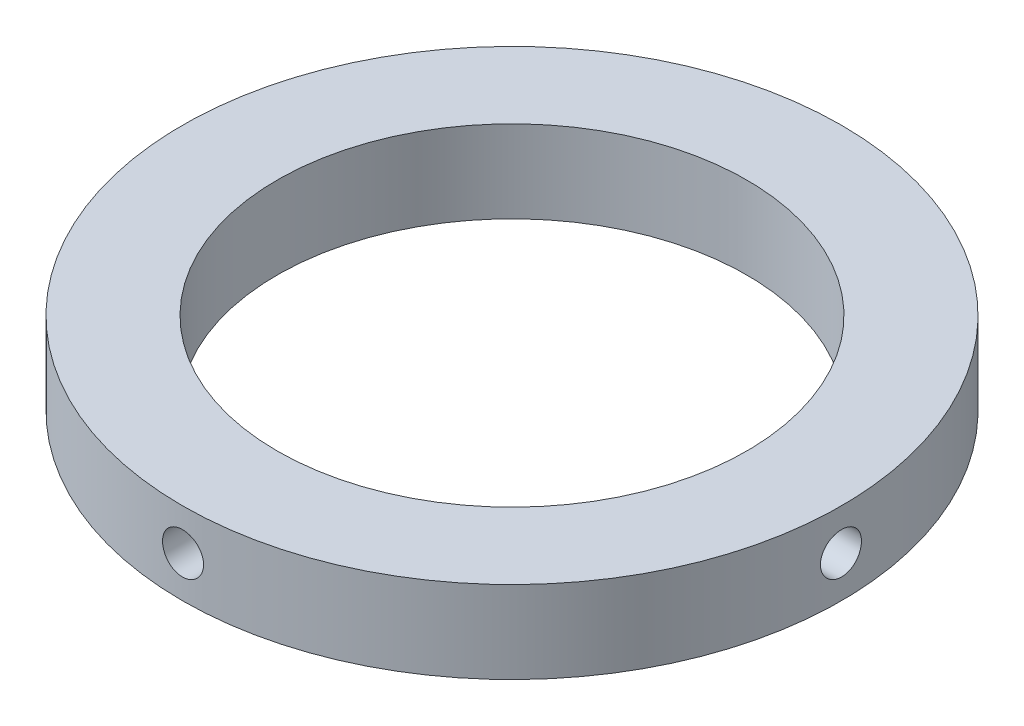
ISO-10303-21;
HEADER;
FILE_DESCRIPTION(('STEP AP214'),'2;1');
FILE_NAME('part.step','',(''),(''),'','','');
FILE_SCHEMA(('AUTOMOTIVE_DESIGN { 1 0 10303 214 1 1 1 1 }'));
ENDSEC;
DATA;
#1=APPLICATION_CONTEXT('core data for automotive mechanical design processes');
#2=APPLICATION_PROTOCOL_DEFINITION('international standard','automotive_design',2000,#1);
#3=PRODUCT_CONTEXT('',#1,'mechanical');
#4=PRODUCT('Part','Part','',(#3));
#5=PRODUCT_RELATED_PRODUCT_CATEGORY('part','',(#4));
#6=PRODUCT_DEFINITION_FORMATION('','',#4);
#7=PRODUCT_DEFINITION_CONTEXT('part definition',#1,'design');
#8=PRODUCT_DEFINITION('design','',#6,#7);
#9=PRODUCT_DEFINITION_SHAPE('','',#8);
#10=(LENGTH_UNIT() NAMED_UNIT(*) SI_UNIT(.MILLI.,.METRE.));
#11=(NAMED_UNIT(*) PLANE_ANGLE_UNIT() SI_UNIT($,.RADIAN.));
#12=(NAMED_UNIT(*) SI_UNIT($,.STERADIAN.) SOLID_ANGLE_UNIT());
#13=UNCERTAINTY_MEASURE_WITH_UNIT(LENGTH_MEASURE(1.E-05),#10,'distance_accuracy_value','');
#14=(GEOMETRIC_REPRESENTATION_CONTEXT(3) GLOBAL_UNCERTAINTY_ASSIGNED_CONTEXT((#13)) GLOBAL_UNIT_ASSIGNED_CONTEXT((#10,
#11,#12)) REPRESENTATION_CONTEXT('',''));
#15=CARTESIAN_POINT('',(0.,0.,0.));
#16=DIRECTION('',(0.,0.,1.));
#17=DIRECTION('',(1.,0.,0.));
#18=AXIS2_PLACEMENT_3D('',#15,#16,#17);
#19=CARTESIAN_POINT('',(0.,22.7096404931965,0.));
#20=DIRECTION('',(0.,1.,0.));
#21=DIRECTION('',(0.,0.,1.));
#22=AXIS2_PLACEMENT_3D('',#19,#20,#21);
#23=CYLINDRICAL_SURFACE('',#22,27.178);
#24=CARTESIAN_POINT('',(0.,-9.525,0.));
#25=DIRECTION('',(0.,1.,0.));
#26=DIRECTION('',(0.,0.,1.));
#27=AXIS2_PLACEMENT_3D('',#24,#25,#26);
#28=CIRCLE('',#27,27.178);
#29=CARTESIAN_POINT('',(0.,-9.525,27.178));
#30=VERTEX_POINT('',#29);
#31=EDGE_CURVE('E59',#30,#30,#28,.T.);
#32=ORIENTED_EDGE('',*,*,#31,.F.);
#33=EDGE_LOOP('',(#32));
#34=FACE_BOUND('',#33,.T.);
#35=CARTESIAN_POINT('',(0.,0.,0.));
#36=DIRECTION('',(0.,1.,0.));
#37=DIRECTION('',(0.,0.,1.));
#38=AXIS2_PLACEMENT_3D('',#35,#36,#37);
#39=CIRCLE('',#38,27.178);
#40=CARTESIAN_POINT('',(0.,0.,27.178));
#41=VERTEX_POINT('',#40);
#42=EDGE_CURVE('E46',#41,#41,#39,.T.);
#43=ORIENTED_EDGE('',*,*,#42,.T.);
#44=EDGE_LOOP('',(#43));
#45=FACE_BOUND('',#44,.T.);
#46=ADVANCED_FACE('F35',(#34,#45),#23,.F.);
#47=CARTESIAN_POINT('',(27.178,0.,0.));
#48=DIRECTION('',(0.,-1.,0.));
#49=DIRECTION('',(0.,0.,-1.));
#50=AXIS2_PLACEMENT_3D('',#47,#48,#49);
#51=PLANE('',#50);
#52=ORIENTED_EDGE('',*,*,#42,.F.);
#53=EDGE_LOOP('',(#52));
#54=FACE_BOUND('',#53,.T.);
#55=CARTESIAN_POINT('',(0.,0.,0.));
#56=DIRECTION('',(0.,1.,0.));
#57=DIRECTION('',(0.,0.,1.));
#58=AXIS2_PLACEMENT_3D('',#55,#56,#57);
#59=CIRCLE('',#58,38.1508);
#60=CARTESIAN_POINT('',(0.,0.,38.1508));
#61=VERTEX_POINT('',#60);
#62=EDGE_CURVE('E50',#61,#61,#59,.T.);
#63=ORIENTED_EDGE('',*,*,#62,.T.);
#64=EDGE_LOOP('',(#63));
#65=FACE_BOUND('',#64,.T.);
#66=ADVANCED_FACE('F124',(#54,#65),#51,.F.);
#67=CARTESIAN_POINT('',(0.,22.7096404931965,0.));
#68=DIRECTION('',(0.,1.,0.));
#69=DIRECTION('',(0.,0.,1.));
#70=AXIS2_PLACEMENT_3D('',#67,#68,#69);
#71=CYLINDRICAL_SURFACE('',#70,38.1508);
#72=CARTESIAN_POINT('',(2.37490000000013,-4.7625,38.0768090920182));
#73=CARTESIAN_POINT('',(2.37489413587054,-4.89576044221332,38.0768100819438));
#74=CARTESIAN_POINT('',(2.36364603924137,-5.02911422015652,38.0775161883294));
#75=CARTESIAN_POINT('',(2.31893657361418,-5.292139622471,38.0802646535465));
#76=CARTESIAN_POINT('',(2.28544934224318,-5.42180677629042,38.0823085681043));
#77=CARTESIAN_POINT('',(2.1972271338628,-5.67361089539293,38.0875002420932));
#78=CARTESIAN_POINT('',(2.14250336402685,-5.79575179318114,38.0906474192143));
#79=CARTESIAN_POINT('',(2.01337959405476,-6.02908230479438,38.0976902671423));
#80=CARTESIAN_POINT('',(1.93898410247809,-6.14027441996588,38.1015857663855));
#81=CARTESIAN_POINT('',(1.77250693564029,-6.348748916997,38.1096929054201));
#82=CARTESIAN_POINT('',(1.68040211679733,-6.4460128031849,38.1139049544608));
#83=CARTESIAN_POINT('',(1.48116851449557,-6.62371161253613,38.1221667814194));
#84=CARTESIAN_POINT('',(1.37403910499195,-6.7041458340926,38.1262165525665));
#85=CARTESIAN_POINT('',(1.14769361590035,-6.84595840493212,38.1337010098159));
#86=CARTESIAN_POINT('',(1.02846798471447,-6.90732153721154,38.1371352038233));
#87=CARTESIAN_POINT('',(0.781381432870346,-7.0091526031743,38.1429972531246));
#88=CARTESIAN_POINT('',(0.653520604057745,-7.04962075906114,38.1454251191201));
#89=CARTESIAN_POINT('',(0.39297057238683,-7.10846204704709,38.14899812944));
#90=CARTESIAN_POINT('',(0.260287906823709,-7.12686402310435,38.1501449481596));
#91=CARTESIAN_POINT('',(-0.00628768139390037,-7.14113965868731,38.1510322802792));
#92=CARTESIAN_POINT('',(-0.140180590481272,-7.13701357044605,38.1507728094246));
#93=CARTESIAN_POINT('',(-0.405180563899317,-7.10637400208002,38.1488781975727));
#94=CARTESIAN_POINT('',(-0.53629123137161,-7.07989155109398,38.1472449632788));
#95=CARTESIAN_POINT('',(-0.792202661450277,-7.00533914665999,38.1427888978946));
#96=CARTESIAN_POINT('',(-0.91700338698951,-6.957269066414,38.139966059817));
#97=CARTESIAN_POINT('',(-1.15685190217948,-6.84087079654324,38.1334453417321));
#98=CARTESIAN_POINT('',(-1.2718928497054,-6.77252854352541,38.1297468546226));
#99=CARTESIAN_POINT('',(-1.48888149211945,-6.61753614849848,38.1218910792771));
#100=CARTESIAN_POINT('',(-1.59082904086112,-6.5308858021659,38.1177337859211));
#101=CARTESIAN_POINT('',(-1.77891807210959,-6.34156165595712,38.1094199524433));
#102=CARTESIAN_POINT('',(-1.86503244858612,-6.23886092399679,38.1052634255623));
#103=CARTESIAN_POINT('',(-2.01880167507849,-6.02044566814982,38.0974267833623));
#104=CARTESIAN_POINT('',(-2.08645651781064,-5.90473113912826,38.0937466682312));
#105=CARTESIAN_POINT('',(-2.20138426186229,-5.66355579329118,38.0872784233891));
#106=CARTESIAN_POINT('',(-2.24865602416464,-5.53809443227981,38.0844903435277));
#107=CARTESIAN_POINT('',(-2.32145703284915,-5.28099470148214,38.0801223662642));
#108=CARTESIAN_POINT('',(-2.34698653295659,-5.14935640379765,38.078542454763));
#109=CARTESIAN_POINT('',(-2.37554456262062,-4.88387596537421,38.0767716250643));
#110=CARTESIAN_POINT('',(-2.37861076963935,-4.75003789247612,38.0765783810341));
#111=CARTESIAN_POINT('',(-2.36225361437003,-4.48374924305812,38.0775966028876));
#112=CARTESIAN_POINT('',(-2.3428303681567,-4.35129865938052,38.0788080615213));
#113=CARTESIAN_POINT('',(-2.28207695841365,-4.09165130885762,38.0824970401971));
#114=CARTESIAN_POINT('',(-2.24076414495911,-3.96445046691895,38.0849735574747));
#115=CARTESIAN_POINT('',(-2.13742189487203,-3.71878759389541,38.0909127162222));
#116=CARTESIAN_POINT('',(-2.07539227186086,-3.6003256414416,38.0943753665638));
#117=CARTESIAN_POINT('',(-1.9322809069873,-3.37533017563438,38.1019022210509));
#118=CARTESIAN_POINT('',(-1.85117391791038,-3.26881274807502,38.1059672196904));
#119=CARTESIAN_POINT('',(-1.67224690008276,-3.07089200982624,38.1142378988531));
#120=CARTESIAN_POINT('',(-1.57442670893701,-2.97948884601266,38.1184435807429));
#121=CARTESIAN_POINT('',(-1.36468789444931,-2.81426398702312,38.1265285018216));
#122=CARTESIAN_POINT('',(-1.25275004490291,-2.740466672447,38.1304072835698));
#123=CARTESIAN_POINT('',(-1.01805012157061,-2.61271518147493,38.1373947640191));
#124=CARTESIAN_POINT('',(-0.895288114121227,-2.5587608834803,38.1405034674392));
#125=CARTESIAN_POINT('',(-0.642514294356841,-2.47226940122217,38.1455983227291));
#126=CARTESIAN_POINT('',(-0.51250778011895,-2.43971678272071,38.1475852834189));
#127=CARTESIAN_POINT('',(-0.248861678354973,-2.39690219738437,38.1502159896755));
#128=CARTESIAN_POINT('',(-0.115222126247927,-2.38664001331552,38.1508597483325));
#129=CARTESIAN_POINT('',(0.151655169187759,-2.38869971215477,38.1507315538221));
#130=CARTESIAN_POINT('',(0.284893209840427,-2.40098343706333,38.1499619926377));
#131=CARTESIAN_POINT('',(0.547411038606428,-2.447707155079,38.147098450074));
#132=CARTESIAN_POINT('',(0.676690819747846,-2.48214718720895,38.1450044663621));
#133=CARTESIAN_POINT('',(0.927628163274157,-2.57219730820203,38.1397274474392));
#134=CARTESIAN_POINT('',(1.04928577692416,-2.62780725466291,38.1365444195537));
#135=CARTESIAN_POINT('',(1.28154243611031,-2.75861329323844,38.1294467063049));
#136=CARTESIAN_POINT('',(1.39214176954976,-2.83380887525548,38.1255320399973));
#137=CARTESIAN_POINT('',(1.59933578468166,-3.00179251125602,38.1174035323818));
#138=CARTESIAN_POINT('',(1.6959081105813,-3.09460811600491,38.1131892291022));
#139=CARTESIAN_POINT('',(1.87213418981923,-3.29516076296566,38.1049400887677));
#140=CARTESIAN_POINT('',(1.95178379632978,-3.40290145183425,38.1009052958921));
#141=CARTESIAN_POINT('',(2.09196199764988,-3.63036821774935,38.0934664290718));
#142=CARTESIAN_POINT('',(2.15246685818721,-3.75010893141391,38.0900631401639));
#143=CARTESIAN_POINT('',(2.25243945975514,-3.99798351897271,38.084282692149));
#144=CARTESIAN_POINT('',(2.29193184490441,-4.12610736183459,38.0819043315978));
#145=CARTESIAN_POINT('',(2.33849192023849,-4.33959610830245,38.0790664594052));
#146=CARTESIAN_POINT('',(2.35212729986054,-4.4235809538405,38.0782237283132));
#147=CARTESIAN_POINT('',(2.37033320377693,-4.59253120823572,38.0770947292795));
#148=CARTESIAN_POINT('',(2.3749037405765,-4.67749661573999,38.0768084605703));
#149=CARTESIAN_POINT('',(2.37490000000013,-4.7625,38.0768090920182));
#150=B_SPLINE_CURVE_WITH_KNOTS('',3,(#72,#73,#74,#75,#76,#77,#78,#79,#80,#81,#82,#83,#84,#85,
#86,#87,#88,#89,#90,#91,#92,#93,#94,#95,#96,#97,#98,#99,#100,#101,#102,#103,#104,#105,#106,#107,
#108,#109,#110,#111,#112,#113,#114,#115,#116,#117,#118,#119,#120,#121,#122,#123,#124,#125,#126,
#127,#128,#129,#130,#131,#132,#133,#134,#135,#136,#137,#138,#139,#140,#141,#142,#143,#144,#145,
#146,#147,#148,#149),.UNSPECIFIED.,.T.,.F.,(4,2,2,2,2,2,2,2,2,2,2,2,2,2,2,2,2,2,2,2,2,2,2,2,2,2,
2,2,2,2,2,2,2,2,2,2,2,2,4),(0.,0.399471011661399,0.799407392231102,1.19913300048188,
1.59876707495754,1.99892700861405,2.39910362109612,2.7995987233652,3.20008956656061,
3.60005633273725,4.00001862073843,4.39942669872803,4.79883712272907,5.19852527991674,
5.59821789797275,5.99858853572004,6.39895933144387,6.79935249719801,7.19974099042739,
7.59945776186392,7.99917247025312,8.39857083028704,8.79797278360192,9.19790631413617,
9.59784373087502,9.99833180773224,10.3988174303438,10.7990139172115,11.199206503901,
11.5987224059799,11.9982390117092,12.3977529300848,12.7972564443702,13.1973898477847,
13.5976211890897,13.9983467816923,14.3986013483959,14.6534139108114,14.9082261217046),.UNSPECIFIED.);
#151=CARTESIAN_POINT('',(2.37490000000013,-4.7625,38.0768090920182));
#152=VERTEX_POINT('',#151);
#153=EDGE_CURVE('E104',#152,#152,#150,.T.);
#154=ORIENTED_EDGE('',*,*,#153,.T.);
#155=EDGE_LOOP('',(#154));
#156=FACE_BOUND('',#155,.T.);
#157=CARTESIAN_POINT('',(38.0768090920182,-4.7625,-2.3749));
#158=CARTESIAN_POINT('',(38.0768100819438,-4.89576044221332,-2.37489413587041));
#159=CARTESIAN_POINT('',(38.0775161883294,-5.02911422015652,-2.36364603924123));
#160=CARTESIAN_POINT('',(38.0802646535465,-5.292139622471,-2.31893657361404));
#161=CARTESIAN_POINT('',(38.0823085681043,-5.42180677629042,-2.28544934224305));
#162=CARTESIAN_POINT('',(38.0875002420932,-5.67361089539293,-2.19722713386266));
#163=CARTESIAN_POINT('',(38.0906474192143,-5.79575179318114,-2.14250336402672));
#164=CARTESIAN_POINT('',(38.0976902671423,-6.02908230479438,-2.01337959405463));
#165=CARTESIAN_POINT('',(38.1015857663855,-6.14027441996588,-1.93898410247796));
#166=CARTESIAN_POINT('',(38.1096929054201,-6.348748916997,-1.77250693564015));
#167=CARTESIAN_POINT('',(38.1139049544608,-6.4460128031849,-1.6804021167972));
#168=CARTESIAN_POINT('',(38.1221667814194,-6.62371161253613,-1.48116851449544));
#169=CARTESIAN_POINT('',(38.1262165525665,-6.7041458340926,-1.37403910499181));
#170=CARTESIAN_POINT('',(38.1337010098159,-6.84595840493212,-1.14769361590022));
#171=CARTESIAN_POINT('',(38.1371352038233,-6.90732153721154,-1.02846798471434));
#172=CARTESIAN_POINT('',(38.1429972531246,-7.0091526031743,-0.781381432870213));
#173=CARTESIAN_POINT('',(38.1454251191201,-7.04962075906114,-0.653520604057612));
#174=CARTESIAN_POINT('',(38.14899812944,-7.10846204704709,-0.392970572386697));
#175=CARTESIAN_POINT('',(38.1501449481596,-7.12686402310435,-0.260287906823576));
#176=CARTESIAN_POINT('',(38.1510322802792,-7.14113965868731,0.00628768139403362));
#177=CARTESIAN_POINT('',(38.1507728094246,-7.13701357044605,0.140180590481405));
#178=CARTESIAN_POINT('',(38.1488781975727,-7.10637400208002,0.40518056389945));
#179=CARTESIAN_POINT('',(38.1472449632788,-7.07989155109398,0.536291231371743));
#180=CARTESIAN_POINT('',(38.1427888978946,-7.00533914665999,0.79220266145041));
#181=CARTESIAN_POINT('',(38.1399660598169,-6.957269066414,0.917003386989643));
#182=CARTESIAN_POINT('',(38.1334453417321,-6.84087079654324,1.15685190217961));
#183=CARTESIAN_POINT('',(38.1297468546226,-6.77252854352541,1.27189284970554));
#184=CARTESIAN_POINT('',(38.1218910792771,-6.61753614849848,1.48888149211958));
#185=CARTESIAN_POINT('',(38.1177337859211,-6.5308858021659,1.59082904086125));
#186=CARTESIAN_POINT('',(38.1094199524433,-6.34156165595712,1.77891807210973));
#187=CARTESIAN_POINT('',(38.1052634255623,-6.23886092399679,1.86503244858626));
#188=CARTESIAN_POINT('',(38.0974267833623,-6.02044566814982,2.01880167507862));
#189=CARTESIAN_POINT('',(38.0937466682312,-5.90473113912826,2.08645651781077));
#190=CARTESIAN_POINT('',(38.0872784233891,-5.66355579329118,2.20138426186243));
#191=CARTESIAN_POINT('',(38.0844903435277,-5.53809443227981,2.24865602416477));
#192=CARTESIAN_POINT('',(38.0801223662642,-5.28099470148214,2.32145703284929));
#193=CARTESIAN_POINT('',(38.078542454763,-5.14935640379765,2.34698653295673));
#194=CARTESIAN_POINT('',(38.0767716250643,-4.88387596537421,2.37554456262075));
#195=CARTESIAN_POINT('',(38.0765783810341,-4.75003789247612,2.37861076963948));
#196=CARTESIAN_POINT('',(38.0775966028876,-4.48374924305812,2.36225361437016));
#197=CARTESIAN_POINT('',(38.0788080615213,-4.35129865938052,2.34283036815684));
#198=CARTESIAN_POINT('',(38.0824970401971,-4.09165130885763,2.28207695841378));
#199=CARTESIAN_POINT('',(38.0849735574747,-3.96445046691895,2.24076414495925));
#200=CARTESIAN_POINT('',(38.0909127162222,-3.71878759389541,2.13742189487216));
#201=CARTESIAN_POINT('',(38.0943753665638,-3.6003256414416,2.07539227186099));
#202=CARTESIAN_POINT('',(38.1019022210508,-3.37533017563438,1.93228090698743));
#203=CARTESIAN_POINT('',(38.1059672196904,-3.26881274807502,1.85117391791051));
#204=CARTESIAN_POINT('',(38.1142378988531,-3.07089200982624,1.67224690008289));
#205=CARTESIAN_POINT('',(38.1184435807429,-2.97948884601266,1.57442670893715));
#206=CARTESIAN_POINT('',(38.1265285018216,-2.81426398702312,1.36468789444944));
#207=CARTESIAN_POINT('',(38.1304072835698,-2.740466672447,1.25275004490305));
#208=CARTESIAN_POINT('',(38.1373947640191,-2.61271518147493,1.01805012157074));
#209=CARTESIAN_POINT('',(38.1405034674392,-2.5587608834803,0.89528811412136));
#210=CARTESIAN_POINT('',(38.1455983227291,-2.47226940122217,0.642514294356974));
#211=CARTESIAN_POINT('',(38.1475852834189,-2.43971678272071,0.512507780119083));
#212=CARTESIAN_POINT('',(38.1502159896755,-2.39690219738437,0.248861678355107));
#213=CARTESIAN_POINT('',(38.1508597483325,-2.38664001331552,0.11522212624806));
#214=CARTESIAN_POINT('',(38.1507315538221,-2.38869971215477,-0.151655169187625));
#215=CARTESIAN_POINT('',(38.1499619926377,-2.40098343706333,-0.284893209840293));
#216=CARTESIAN_POINT('',(38.147098450074,-2.447707155079,-0.547411038606295));
#217=CARTESIAN_POINT('',(38.1450044663621,-2.48214718720895,-0.676690819747713));
#218=CARTESIAN_POINT('',(38.1397274474392,-2.57219730820203,-0.927628163274024));
#219=CARTESIAN_POINT('',(38.1365444195537,-2.62780725466291,-1.04928577692403));
#220=CARTESIAN_POINT('',(38.1294467063049,-2.75861329323844,-1.28154243611017));
#221=CARTESIAN_POINT('',(38.1255320399973,-2.83380887525548,-1.39214176954962));
#222=CARTESIAN_POINT('',(38.1174035323818,-3.00179251125602,-1.59933578468153));
#223=CARTESIAN_POINT('',(38.1131892291022,-3.09460811600491,-1.69590811058117));
#224=CARTESIAN_POINT('',(38.1049400887678,-3.29516076296566,-1.8721341898191));
#225=CARTESIAN_POINT('',(38.1009052958921,-3.40290145183425,-1.95178379632965));
#226=CARTESIAN_POINT('',(38.0934664290718,-3.63036821774935,-2.09196199764974));
#227=CARTESIAN_POINT('',(38.090063140164,-3.75010893141391,-2.15246685818707));
#228=CARTESIAN_POINT('',(38.084282692149,-3.99798351897271,-2.25243945975501));
#229=CARTESIAN_POINT('',(38.0819043315978,-4.12610736183459,-2.29193184490427));
#230=CARTESIAN_POINT('',(38.0790664594052,-4.33959610830245,-2.33849192023835));
#231=CARTESIAN_POINT('',(38.0782237283132,-4.4235809538405,-2.35212729986041));
#232=CARTESIAN_POINT('',(38.0770947292796,-4.59253120823572,-2.3703332037768));
#233=CARTESIAN_POINT('',(38.0768084605703,-4.67749661573999,-2.37490374057637));
#234=CARTESIAN_POINT('',(38.0768090920182,-4.7625,-2.3749));
#235=B_SPLINE_CURVE_WITH_KNOTS('',3,(#157,#158,#159,#160,#161,#162,#163,#164,#165,#166,#167,
#168,#169,#170,#171,#172,#173,#174,#175,#176,#177,#178,#179,#180,#181,#182,#183,#184,#185,#186,
#187,#188,#189,#190,#191,#192,#193,#194,#195,#196,#197,#198,#199,#200,#201,#202,#203,#204,#205,
#206,#207,#208,#209,#210,#211,#212,#213,#214,#215,#216,#217,#218,#219,#220,#221,#222,#223,#224,
#225,#226,#227,#228,#229,#230,#231,#232,#233,#234),.UNSPECIFIED.,.T.,.F.,(4,2,2,2,2,2,2,2,2,2,2,
2,2,2,2,2,2,2,2,2,2,2,2,2,2,2,2,2,2,2,2,2,2,2,2,2,2,2,4),(0.,0.399471011661399,
0.799407392231102,1.19913300048188,1.59876707495754,1.99892700861405,2.39910362109612,
2.7995987233652,3.20008956656061,3.60005633273725,4.00001862073844,4.39942669872803,
4.79883712272907,5.19852527991674,5.59821789797275,5.99858853572004,6.39895933144387,
6.79935249719802,7.19974099042739,7.59945776186392,7.99917247025312,8.39857083028704,
8.79797278360192,9.19790631413617,9.59784373087502,9.99833180773224,10.3988174303438,
10.7990139172115,11.199206503901,11.5987224059799,11.9982390117092,12.3977529300848,
12.7972564443702,13.1973898477847,13.5976211890897,13.9983467816923,14.3986013483959,
14.6534139108114,14.9082261217046),.UNSPECIFIED.);
#236=CARTESIAN_POINT('',(38.0768090920182,-4.7625,-2.3749));
#237=VERTEX_POINT('',#236);
#238=EDGE_CURVE('E69',#237,#237,#235,.T.);
#239=ORIENTED_EDGE('',*,*,#238,.T.);
#240=EDGE_LOOP('',(#239));
#241=FACE_BOUND('',#240,.T.);
#242=CARTESIAN_POINT('',(-2.3749000000004,-4.7625,-38.0768090920182));
#243=CARTESIAN_POINT('',(-2.37489413587081,-4.89576044221332,-38.0768100819438));
#244=CARTESIAN_POINT('',(-2.36364603924163,-5.02911422015652,-38.0775161883294));
#245=CARTESIAN_POINT('',(-2.31893657361444,-5.292139622471,-38.0802646535465));
#246=CARTESIAN_POINT('',(-2.28544934224345,-5.42180677629042,-38.0823085681043));
#247=CARTESIAN_POINT('',(-2.19722713386306,-5.67361089539293,-38.0875002420932));
#248=CARTESIAN_POINT('',(-2.14250336402712,-5.79575179318114,-38.0906474192143));
#249=CARTESIAN_POINT('',(-2.01337959405503,-6.02908230479438,-38.0976902671423));
#250=CARTESIAN_POINT('',(-1.93898410247836,-6.14027441996588,-38.1015857663854));
#251=CARTESIAN_POINT('',(-1.77250693564055,-6.348748916997,-38.1096929054201));
#252=CARTESIAN_POINT('',(-1.68040211679759,-6.4460128031849,-38.1139049544607));
#253=CARTESIAN_POINT('',(-1.48116851449584,-6.62371161253613,-38.1221667814194));
#254=CARTESIAN_POINT('',(-1.37403910499221,-6.7041458340926,-38.1262165525665));
#255=CARTESIAN_POINT('',(-1.14769361590062,-6.84595840493212,-38.1337010098159));
#256=CARTESIAN_POINT('',(-1.02846798471474,-6.90732153721154,-38.1371352038233));
#257=CARTESIAN_POINT('',(-0.781381432870613,-7.0091526031743,-38.1429972531246));
#258=CARTESIAN_POINT('',(-0.653520604058011,-7.04962075906114,-38.14542511912));
#259=CARTESIAN_POINT('',(-0.392970572387096,-7.10846204704709,-38.14899812944));
#260=CARTESIAN_POINT('',(-0.260287906823976,-7.12686402310435,-38.1501449481596));
#261=CARTESIAN_POINT('',(0.00628768139363401,-7.14113965868731,-38.1510322802792));
#262=CARTESIAN_POINT('',(0.140180590481006,-7.13701357044605,-38.1507728094246));
#263=CARTESIAN_POINT('',(0.40518056389905,-7.10637400208002,-38.1488781975727));
#264=CARTESIAN_POINT('',(0.536291231371343,-7.07989155109398,-38.1472449632788));
#265=CARTESIAN_POINT('',(0.79220266145001,-7.00533914665999,-38.1427888978946));
#266=CARTESIAN_POINT('',(0.917003386989244,-6.957269066414,-38.139966059817));
#267=CARTESIAN_POINT('',(1.15685190217921,-6.84087079654324,-38.1334453417321));
#268=CARTESIAN_POINT('',(1.27189284970514,-6.77252854352541,-38.1297468546226));
#269=CARTESIAN_POINT('',(1.48888149211918,-6.61753614849848,-38.1218910792771));
#270=CARTESIAN_POINT('',(1.59082904086086,-6.5308858021659,-38.1177337859211));
#271=CARTESIAN_POINT('',(1.77891807210933,-6.34156165595712,-38.1094199524433));
#272=CARTESIAN_POINT('',(1.86503244858586,-6.23886092399679,-38.1052634255623));
#273=CARTESIAN_POINT('',(2.01880167507823,-6.02044566814982,-38.0974267833623));
#274=CARTESIAN_POINT('',(2.08645651781037,-5.90473113912826,-38.0937466682312));
#275=CARTESIAN_POINT('',(2.20138426186203,-5.66355579329118,-38.0872784233891));
#276=CARTESIAN_POINT('',(2.24865602416437,-5.53809443227981,-38.0844903435278));
#277=CARTESIAN_POINT('',(2.32145703284889,-5.28099470148214,-38.0801223662642));
#278=CARTESIAN_POINT('',(2.34698653295633,-5.14935640379765,-38.078542454763));
#279=CARTESIAN_POINT('',(2.37554456262035,-4.88387596537421,-38.0767716250643));
#280=CARTESIAN_POINT('',(2.37861076963908,-4.75003789247612,-38.0765783810341));
#281=CARTESIAN_POINT('',(2.36225361436976,-4.48374924305812,-38.0775966028876));
#282=CARTESIAN_POINT('',(2.34283036815644,-4.35129865938052,-38.0788080615213));
#283=CARTESIAN_POINT('',(2.28207695841338,-4.09165130885762,-38.0824970401972));
#284=CARTESIAN_POINT('',(2.24076414495885,-3.96445046691895,-38.0849735574747));
#285=CARTESIAN_POINT('',(2.13742189487176,-3.71878759389541,-38.0909127162222));
#286=CARTESIAN_POINT('',(2.07539227186059,-3.6003256414416,-38.0943753665638));
#287=CARTESIAN_POINT('',(1.93228090698703,-3.37533017563438,-38.1019022210509));
#288=CARTESIAN_POINT('',(1.85117391791011,-3.26881274807502,-38.1059672196904));
#289=CARTESIAN_POINT('',(1.6722469000825,-3.07089200982624,-38.1142378988531));
#290=CARTESIAN_POINT('',(1.57442670893675,-2.97948884601266,-38.1184435807429));
#291=CARTESIAN_POINT('',(1.36468789444904,-2.81426398702312,-38.1265285018216));
#292=CARTESIAN_POINT('',(1.25275004490265,-2.740466672447,-38.1304072835698));
#293=CARTESIAN_POINT('',(1.01805012157034,-2.61271518147493,-38.1373947640191));
#294=CARTESIAN_POINT('',(0.895288114120961,-2.5587608834803,-38.1405034674393));
#295=CARTESIAN_POINT('',(0.642514294356574,-2.47226940122217,-38.1455983227291));
#296=CARTESIAN_POINT('',(0.512507780118682,-2.43971678272071,-38.1475852834189));
#297=CARTESIAN_POINT('',(0.248861678354706,-2.39690219738437,-38.1502159896755));
#298=CARTESIAN_POINT('',(0.11522212624766,-2.38664001331552,-38.1508597483325));
#299=CARTESIAN_POINT('',(-0.151655169188025,-2.38869971215477,-38.1507315538221));
#300=CARTESIAN_POINT('',(-0.284893209840693,-2.40098343706333,-38.1499619926377));
#301=CARTESIAN_POINT('',(-0.547411038606695,-2.447707155079,-38.147098450074));
#302=CARTESIAN_POINT('',(-0.676690819748112,-2.48214718720895,-38.1450044663621));
#303=CARTESIAN_POINT('',(-0.927628163274424,-2.57219730820203,-38.1397274474392));
#304=CARTESIAN_POINT('',(-1.04928577692443,-2.62780725466291,-38.1365444195537));
#305=CARTESIAN_POINT('',(-1.28154243611057,-2.75861329323844,-38.1294467063049));
#306=CARTESIAN_POINT('',(-1.39214176955002,-2.83380887525548,-38.1255320399973));
#307=CARTESIAN_POINT('',(-1.59933578468192,-3.00179251125602,-38.1174035323818));
#308=CARTESIAN_POINT('',(-1.69590811058157,-3.09460811600491,-38.1131892291022));
#309=CARTESIAN_POINT('',(-1.8721341898195,-3.29516076296565,-38.1049400887677));
#310=CARTESIAN_POINT('',(-1.95178379633004,-3.40290145183425,-38.1009052958921));
#311=CARTESIAN_POINT('',(-2.09196199765014,-3.63036821774935,-38.0934664290718));
#312=CARTESIAN_POINT('',(-2.15246685818747,-3.75010893141391,-38.0900631401639));
#313=CARTESIAN_POINT('',(-2.25243945975541,-3.99798351897271,-38.084282692149));
#314=CARTESIAN_POINT('',(-2.29193184490467,-4.12610736183459,-38.0819043315977));
#315=CARTESIAN_POINT('',(-2.33849192023875,-4.33959610830245,-38.0790664594052));
#316=CARTESIAN_POINT('',(-2.35212729986081,-4.4235809538405,-38.0782237283132));
#317=CARTESIAN_POINT('',(-2.3703332037772,-4.59253120823572,-38.0770947292795));
#318=CARTESIAN_POINT('',(-2.37490374057677,-4.67749661573999,-38.0768084605703));
#319=CARTESIAN_POINT('',(-2.3749000000004,-4.7625,-38.0768090920182));
#320=B_SPLINE_CURVE_WITH_KNOTS('',3,(#242,#243,#244,#245,#246,#247,#248,#249,#250,#251,#252,
#253,#254,#255,#256,#257,#258,#259,#260,#261,#262,#263,#264,#265,#266,#267,#268,#269,#270,#271,
#272,#273,#274,#275,#276,#277,#278,#279,#280,#281,#282,#283,#284,#285,#286,#287,#288,#289,#290,
#291,#292,#293,#294,#295,#296,#297,#298,#299,#300,#301,#302,#303,#304,#305,#306,#307,#308,#309,
#310,#311,#312,#313,#314,#315,#316,#317,#318,#319),.UNSPECIFIED.,.T.,.F.,(4,2,2,2,2,2,2,2,2,2,2,
2,2,2,2,2,2,2,2,2,2,2,2,2,2,2,2,2,2,2,2,2,2,2,2,2,2,2,4),(0.,0.399471011661399,
0.799407392231102,1.19913300048188,1.59876707495754,1.99892700861405,2.39910362109612,
2.7995987233652,3.20008956656061,3.60005633273725,4.00001862073844,4.39942669872803,
4.79883712272907,5.19852527991674,5.59821789797275,5.99858853572004,6.39895933144387,
6.79935249719802,7.19974099042739,7.59945776186392,7.99917247025312,8.39857083028704,
8.79797278360192,9.19790631413617,9.59784373087502,9.99833180773223,10.3988174303438,
10.7990139172115,11.199206503901,11.5987224059799,11.9982390117092,12.3977529300848,
12.7972564443702,13.1973898477847,13.5976211890897,13.9983467816923,14.3986013483959,
14.6534139108114,14.9082261217046),.UNSPECIFIED.);
#321=CARTESIAN_POINT('',(-2.3749000000004,-4.7625,-38.0768090920182));
#322=VERTEX_POINT('',#321);
#323=EDGE_CURVE('E70',#322,#322,#320,.T.);
#324=ORIENTED_EDGE('',*,*,#323,.T.);
#325=EDGE_LOOP('',(#324));
#326=FACE_BOUND('',#325,.T.);
#327=CARTESIAN_POINT('',(-38.0768090920182,-4.7625,2.3749));
#328=CARTESIAN_POINT('',(-38.0768100819438,-4.89576044221332,2.37489413587041));
#329=CARTESIAN_POINT('',(-38.0775161883294,-5.02911422015652,2.36364603924123));
#330=CARTESIAN_POINT('',(-38.0802646535465,-5.292139622471,2.31893657361404));
#331=CARTESIAN_POINT('',(-38.0823085681043,-5.42180677629042,2.28544934224305));
#332=CARTESIAN_POINT('',(-38.0875002420932,-5.67361089539293,2.19722713386266));
#333=CARTESIAN_POINT('',(-38.0906474192143,-5.79575179318114,2.14250336402672));
#334=CARTESIAN_POINT('',(-38.0976902671423,-6.02908230479438,2.01337959405463));
#335=CARTESIAN_POINT('',(-38.1015857663855,-6.14027441996588,1.93898410247796));
#336=CARTESIAN_POINT('',(-38.1096929054201,-6.348748916997,1.77250693564015));
#337=CARTESIAN_POINT('',(-38.1139049544608,-6.4460128031849,1.6804021167972));
#338=CARTESIAN_POINT('',(-38.1221667814194,-6.62371161253613,1.48116851449544));
#339=CARTESIAN_POINT('',(-38.1262165525665,-6.7041458340926,1.37403910499181));
#340=CARTESIAN_POINT('',(-38.1337010098159,-6.84595840493212,1.14769361590022));
#341=CARTESIAN_POINT('',(-38.1371352038233,-6.90732153721154,1.02846798471434));
#342=CARTESIAN_POINT('',(-38.1429972531246,-7.0091526031743,0.781381432870213));
#343=CARTESIAN_POINT('',(-38.1454251191201,-7.04962075906114,0.653520604057612));
#344=CARTESIAN_POINT('',(-38.14899812944,-7.10846204704709,0.392970572386697));
#345=CARTESIAN_POINT('',(-38.1501449481596,-7.12686402310435,0.260287906823576));
#346=CARTESIAN_POINT('',(-38.1510322802792,-7.14113965868731,-0.00628768139403362));
#347=CARTESIAN_POINT('',(-38.1507728094246,-7.13701357044605,-0.140180590481405));
#348=CARTESIAN_POINT('',(-38.1488781975727,-7.10637400208002,-0.40518056389945));
#349=CARTESIAN_POINT('',(-38.1472449632788,-7.07989155109398,-0.536291231371743));
#350=CARTESIAN_POINT('',(-38.1427888978946,-7.00533914665999,-0.79220266145041));
#351=CARTESIAN_POINT('',(-38.1399660598169,-6.957269066414,-0.917003386989643));
#352=CARTESIAN_POINT('',(-38.1334453417321,-6.84087079654324,-1.15685190217961));
#353=CARTESIAN_POINT('',(-38.1297468546226,-6.77252854352541,-1.27189284970554));
#354=CARTESIAN_POINT('',(-38.1218910792771,-6.61753614849848,-1.48888149211958));
#355=CARTESIAN_POINT('',(-38.1177337859211,-6.5308858021659,-1.59082904086125));
#356=CARTESIAN_POINT('',(-38.1094199524433,-6.34156165595712,-1.77891807210973));
#357=CARTESIAN_POINT('',(-38.1052634255623,-6.23886092399679,-1.86503244858626));
#358=CARTESIAN_POINT('',(-38.0974267833623,-6.02044566814982,-2.01880167507862));
#359=CARTESIAN_POINT('',(-38.0937466682312,-5.90473113912826,-2.08645651781077));
#360=CARTESIAN_POINT('',(-38.0872784233891,-5.66355579329118,-2.20138426186243));
#361=CARTESIAN_POINT('',(-38.0844903435277,-5.53809443227981,-2.24865602416477));
#362=CARTESIAN_POINT('',(-38.0801223662642,-5.28099470148214,-2.32145703284929));
#363=CARTESIAN_POINT('',(-38.078542454763,-5.14935640379765,-2.34698653295673));
#364=CARTESIAN_POINT('',(-38.0767716250643,-4.88387596537421,-2.37554456262075));
#365=CARTESIAN_POINT('',(-38.0765783810341,-4.75003789247612,-2.37861076963948));
#366=CARTESIAN_POINT('',(-38.0775966028876,-4.48374924305812,-2.36225361437016));
#367=CARTESIAN_POINT('',(-38.0788080615213,-4.35129865938052,-2.34283036815684));
#368=CARTESIAN_POINT('',(-38.0824970401971,-4.09165130885763,-2.28207695841378));
#369=CARTESIAN_POINT('',(-38.0849735574747,-3.96445046691895,-2.24076414495925));
#370=CARTESIAN_POINT('',(-38.0909127162222,-3.71878759389541,-2.13742189487216));
#371=CARTESIAN_POINT('',(-38.0943753665638,-3.6003256414416,-2.07539227186099));
#372=CARTESIAN_POINT('',(-38.1019022210508,-3.37533017563438,-1.93228090698743));
#373=CARTESIAN_POINT('',(-38.1059672196904,-3.26881274807502,-1.85117391791051));
#374=CARTESIAN_POINT('',(-38.1142378988531,-3.07089200982624,-1.67224690008289));
#375=CARTESIAN_POINT('',(-38.1184435807429,-2.97948884601266,-1.57442670893715));
#376=CARTESIAN_POINT('',(-38.1265285018216,-2.81426398702312,-1.36468789444944));
#377=CARTESIAN_POINT('',(-38.1304072835698,-2.740466672447,-1.25275004490305));
#378=CARTESIAN_POINT('',(-38.1373947640191,-2.61271518147493,-1.01805012157074));
#379=CARTESIAN_POINT('',(-38.1405034674392,-2.5587608834803,-0.89528811412136));
#380=CARTESIAN_POINT('',(-38.1455983227291,-2.47226940122217,-0.642514294356974));
#381=CARTESIAN_POINT('',(-38.1475852834189,-2.43971678272071,-0.512507780119083));
#382=CARTESIAN_POINT('',(-38.1502159896755,-2.39690219738437,-0.248861678355107));
#383=CARTESIAN_POINT('',(-38.1508597483325,-2.38664001331552,-0.11522212624806));
#384=CARTESIAN_POINT('',(-38.1507315538221,-2.38869971215477,0.151655169187625));
#385=CARTESIAN_POINT('',(-38.1499619926377,-2.40098343706333,0.284893209840293));
#386=CARTESIAN_POINT('',(-38.147098450074,-2.447707155079,0.547411038606295));
#387=CARTESIAN_POINT('',(-38.1450044663621,-2.48214718720895,0.676690819747713));
#388=CARTESIAN_POINT('',(-38.1397274474392,-2.57219730820203,0.927628163274024));
#389=CARTESIAN_POINT('',(-38.1365444195537,-2.62780725466291,1.04928577692403));
#390=CARTESIAN_POINT('',(-38.1294467063049,-2.75861329323844,1.28154243611017));
#391=CARTESIAN_POINT('',(-38.1255320399973,-2.83380887525548,1.39214176954962));
#392=CARTESIAN_POINT('',(-38.1174035323818,-3.00179251125602,1.59933578468153));
#393=CARTESIAN_POINT('',(-38.1131892291022,-3.09460811600491,1.69590811058117));
#394=CARTESIAN_POINT('',(-38.1049400887678,-3.29516076296566,1.8721341898191));
#395=CARTESIAN_POINT('',(-38.1009052958921,-3.40290145183425,1.95178379632965));
#396=CARTESIAN_POINT('',(-38.0934664290718,-3.63036821774935,2.09196199764974));
#397=CARTESIAN_POINT('',(-38.090063140164,-3.75010893141391,2.15246685818707));
#398=CARTESIAN_POINT('',(-38.084282692149,-3.99798351897271,2.25243945975501));
#399=CARTESIAN_POINT('',(-38.0819043315978,-4.12610736183459,2.29193184490427));
#400=CARTESIAN_POINT('',(-38.0790664594052,-4.33959610830245,2.33849192023835));
#401=CARTESIAN_POINT('',(-38.0782237283132,-4.4235809538405,2.35212729986041));
#402=CARTESIAN_POINT('',(-38.0770947292796,-4.59253120823572,2.3703332037768));
#403=CARTESIAN_POINT('',(-38.0768084605703,-4.67749661573999,2.37490374057637));
#404=CARTESIAN_POINT('',(-38.0768090920182,-4.7625,2.3749));
#405=B_SPLINE_CURVE_WITH_KNOTS('',3,(#327,#328,#329,#330,#331,#332,#333,#334,#335,#336,#337,
#338,#339,#340,#341,#342,#343,#344,#345,#346,#347,#348,#349,#350,#351,#352,#353,#354,#355,#356,
#357,#358,#359,#360,#361,#362,#363,#364,#365,#366,#367,#368,#369,#370,#371,#372,#373,#374,#375,
#376,#377,#378,#379,#380,#381,#382,#383,#384,#385,#386,#387,#388,#389,#390,#391,#392,#393,#394,
#395,#396,#397,#398,#399,#400,#401,#402,#403,#404),.UNSPECIFIED.,.T.,.F.,(4,2,2,2,2,2,2,2,2,2,2,
2,2,2,2,2,2,2,2,2,2,2,2,2,2,2,2,2,2,2,2,2,2,2,2,2,2,2,4),(0.,0.399471011661399,
0.799407392231102,1.19913300048188,1.59876707495754,1.99892700861405,2.39910362109612,
2.7995987233652,3.20008956656061,3.60005633273725,4.00001862073844,4.39942669872803,
4.79883712272907,5.19852527991674,5.59821789797275,5.99858853572004,6.39895933144387,
6.79935249719802,7.19974099042739,7.59945776186392,7.99917247025312,8.39857083028704,
8.79797278360192,9.19790631413617,9.59784373087502,9.99833180773224,10.3988174303438,
10.7990139172115,11.199206503901,11.5987224059799,11.9982390117092,12.3977529300848,
12.7972564443702,13.1973898477847,13.5976211890897,13.9983467816923,14.3986013483959,
14.6534139108114,14.9082261217046),.UNSPECIFIED.);
#406=CARTESIAN_POINT('',(-38.0768090920182,-4.7625,2.3749));
#407=VERTEX_POINT('',#406);
#408=EDGE_CURVE('E10',#407,#407,#405,.T.);
#409=ORIENTED_EDGE('',*,*,#408,.T.);
#410=EDGE_LOOP('',(#409));
#411=FACE_BOUND('',#410,.T.);
#412=ORIENTED_EDGE('',*,*,#62,.F.);
#413=EDGE_LOOP('',(#412));
#414=FACE_BOUND('',#413,.T.);
#415=CARTESIAN_POINT('',(0.,-9.525,0.));
#416=DIRECTION('',(0.,1.,0.));
#417=DIRECTION('',(0.,0.,1.));
#418=AXIS2_PLACEMENT_3D('',#415,#416,#417);
#419=CIRCLE('',#418,38.1508);
#420=CARTESIAN_POINT('',(0.,-9.525,38.1508));
#421=VERTEX_POINT('',#420);
#422=EDGE_CURVE('E54',#421,#421,#419,.T.);
#423=ORIENTED_EDGE('',*,*,#422,.T.);
#424=EDGE_LOOP('',(#423));
#425=FACE_BOUND('',#424,.T.);
#426=ADVANCED_FACE('F129',(#156,#241,#326,#411,#414,#425),#71,.T.);
#427=CARTESIAN_POINT('',(27.178,-9.525,0.));
#428=DIRECTION('',(0.,1.,0.));
#429=DIRECTION('',(0.,0.,1.));
#430=AXIS2_PLACEMENT_3D('',#427,#428,#429);
#431=PLANE('',#430);
#432=ORIENTED_EDGE('',*,*,#422,.F.);
#433=EDGE_LOOP('',(#432));
#434=FACE_BOUND('',#433,.T.);
#435=ORIENTED_EDGE('',*,*,#31,.T.);
#436=EDGE_LOOP('',(#435));
#437=FACE_BOUND('',#436,.T.);
#438=ADVANCED_FACE('F133',(#434,#437),#431,.F.);
#439=CARTESIAN_POINT('',(-31.8008,-4.7625,0.));
#440=DIRECTION('',(-1.,0.,0.));
#441=DIRECTION('',(0.,0.,1.));
#442=AXIS2_PLACEMENT_3D('',#439,#440,#441);
#443=CYLINDRICAL_SURFACE('',#442,2.3749);
#444=CARTESIAN_POINT('',(-31.8008,-4.7625,0.));
#445=DIRECTION('',(-1.,0.,0.));
#446=DIRECTION('',(0.,0.,1.));
#447=AXIS2_PLACEMENT_3D('',#444,#445,#446);
#448=CIRCLE('',#447,2.3749);
#449=CARTESIAN_POINT('',(-31.8008,-4.7625,2.3749));
#450=VERTEX_POINT('',#449);
#451=EDGE_CURVE('E62',#450,#450,#448,.T.);
#452=ORIENTED_EDGE('',*,*,#451,.F.);
#453=EDGE_LOOP('',(#452));
#454=FACE_BOUND('',#453,.T.);
#455=ORIENTED_EDGE('',*,*,#408,.F.);
#456=EDGE_LOOP('',(#455));
#457=FACE_BOUND('',#456,.T.);
#458=ADVANCED_FACE('F135',(#454,#457),#443,.F.);
#459=CARTESIAN_POINT('',(-31.8008,-4.7625,0.));
#460=DIRECTION('',(-1.,0.,0.));
#461=DIRECTION('',(0.,0.,1.));
#462=AXIS2_PLACEMENT_3D('',#459,#460,#461);
#463=PLANE('',#462);
#464=ORIENTED_EDGE('',*,*,#451,.T.);
#465=EDGE_LOOP('',(#464));
#466=FACE_BOUND('',#465,.T.);
#467=ADVANCED_FACE('F87',(#466),#463,.T.);
#468=CARTESIAN_POINT('',(-3.33095699280848E-13,-4.7625,-31.8008));
#469=DIRECTION('',(0.,0.,-1.));
#470=DIRECTION('',(-1.,0.,0.));
#471=AXIS2_PLACEMENT_3D('',#468,#469,#470);
#472=CYLINDRICAL_SURFACE('',#471,2.3749);
#473=CARTESIAN_POINT('',(-3.33095699280848E-13,-4.7625,-31.8008));
#474=DIRECTION('',(0.,0.,-1.));
#475=DIRECTION('',(-1.,0.,0.));
#476=AXIS2_PLACEMENT_3D('',#473,#474,#475);
#477=CIRCLE('',#476,2.3749);
#478=CARTESIAN_POINT('',(-2.37490000000033,-4.7625,-31.8008));
#479=VERTEX_POINT('',#478);
#480=EDGE_CURVE('E66',#479,#479,#477,.T.);
#481=ORIENTED_EDGE('',*,*,#480,.F.);
#482=EDGE_LOOP('',(#481));
#483=FACE_BOUND('',#482,.T.);
#484=ORIENTED_EDGE('',*,*,#323,.F.);
#485=EDGE_LOOP('',(#484));
#486=FACE_BOUND('',#485,.T.);
#487=ADVANCED_FACE('F82',(#483,#486),#472,.F.);
#488=CARTESIAN_POINT('',(-3.33095699280848E-13,-4.7625,-31.8008));
#489=DIRECTION('',(0.,0.,-1.));
#490=DIRECTION('',(-1.,0.,0.));
#491=AXIS2_PLACEMENT_3D('',#488,#489,#490);
#492=PLANE('',#491);
#493=ORIENTED_EDGE('',*,*,#480,.T.);
#494=EDGE_LOOP('',(#493));
#495=FACE_BOUND('',#494,.T.);
#496=ADVANCED_FACE('F86',(#495),#492,.T.);
#497=CARTESIAN_POINT('',(31.8008,-4.7625,0.));
#498=DIRECTION('',(1.,0.,0.));
#499=DIRECTION('',(0.,0.,-1.));
#500=AXIS2_PLACEMENT_3D('',#497,#498,#499);
#501=CYLINDRICAL_SURFACE('',#500,2.3749);
#502=CARTESIAN_POINT('',(31.8008,-4.7625,0.));
#503=DIRECTION('',(1.,0.,0.));
#504=DIRECTION('',(0.,0.,-1.));
#505=AXIS2_PLACEMENT_3D('',#502,#503,#504);
#506=CIRCLE('',#505,2.3749);
#507=CARTESIAN_POINT('',(31.8008,-4.7625,-2.3749));
#508=VERTEX_POINT('',#507);
#509=EDGE_CURVE('E78',#508,#508,#506,.T.);
#510=ORIENTED_EDGE('',*,*,#509,.F.);
#511=EDGE_LOOP('',(#510));
#512=FACE_BOUND('',#511,.T.);
#513=ORIENTED_EDGE('',*,*,#238,.F.);
#514=EDGE_LOOP('',(#513));
#515=FACE_BOUND('',#514,.T.);
#516=ADVANCED_FACE('F91',(#512,#515),#501,.F.);
#517=CARTESIAN_POINT('',(31.8008,-4.7625,0.));
#518=DIRECTION('',(1.,0.,0.));
#519=DIRECTION('',(0.,0.,-1.));
#520=AXIS2_PLACEMENT_3D('',#517,#518,#519);
#521=PLANE('',#520);
#522=ORIENTED_EDGE('',*,*,#509,.T.);
#523=EDGE_LOOP('',(#522));
#524=FACE_BOUND('',#523,.T.);
#525=ADVANCED_FACE('F117',(#524),#521,.T.);
#526=CARTESIAN_POINT('',(1.11031899760283E-13,-4.7625,31.8008));
#527=DIRECTION('',(0.,0.,1.));
#528=DIRECTION('',(1.,0.,0.));
#529=AXIS2_PLACEMENT_3D('',#526,#527,#528);
#530=CYLINDRICAL_SURFACE('',#529,2.3749);
#531=CARTESIAN_POINT('',(1.11031899760283E-13,-4.7625,31.8008));
#532=DIRECTION('',(0.,0.,1.));
#533=DIRECTION('',(1.,0.,0.));
#534=AXIS2_PLACEMENT_3D('',#531,#532,#533);
#535=CIRCLE('',#534,2.3749);
#536=CARTESIAN_POINT('',(2.37490000000011,-4.7625,31.8008));
#537=VERTEX_POINT('',#536);
#538=EDGE_CURVE('E65',#537,#537,#535,.T.);
#539=ORIENTED_EDGE('',*,*,#538,.F.);
#540=EDGE_LOOP('',(#539));
#541=FACE_BOUND('',#540,.T.);
#542=ORIENTED_EDGE('',*,*,#153,.F.);
#543=EDGE_LOOP('',(#542));
#544=FACE_BOUND('',#543,.T.);
#545=ADVANCED_FACE('F112',(#541,#544),#530,.F.);
#546=CARTESIAN_POINT('',(1.11031899760283E-13,-4.7625,31.8008));
#547=DIRECTION('',(0.,0.,1.));
#548=DIRECTION('',(1.,0.,0.));
#549=AXIS2_PLACEMENT_3D('',#546,#547,#548);
#550=PLANE('',#549);
#551=ORIENTED_EDGE('',*,*,#538,.T.);
#552=EDGE_LOOP('',(#551));
#553=FACE_BOUND('',#552,.T.);
#554=ADVANCED_FACE('F116',(#553),#550,.T.);
#555=CLOSED_SHELL('',(#46,#66,#426,#438,#458,#467,#487,#496,#516,#525,#545,#554));
#556=MANIFOLD_SOLID_BREP('B2',#555);
#557=ADVANCED_BREP_SHAPE_REPRESENTATION('',(#18,#556),#14);
#558=SHAPE_DEFINITION_REPRESENTATION(#9,#557);
ENDSEC;
END-ISO-10303-21;
